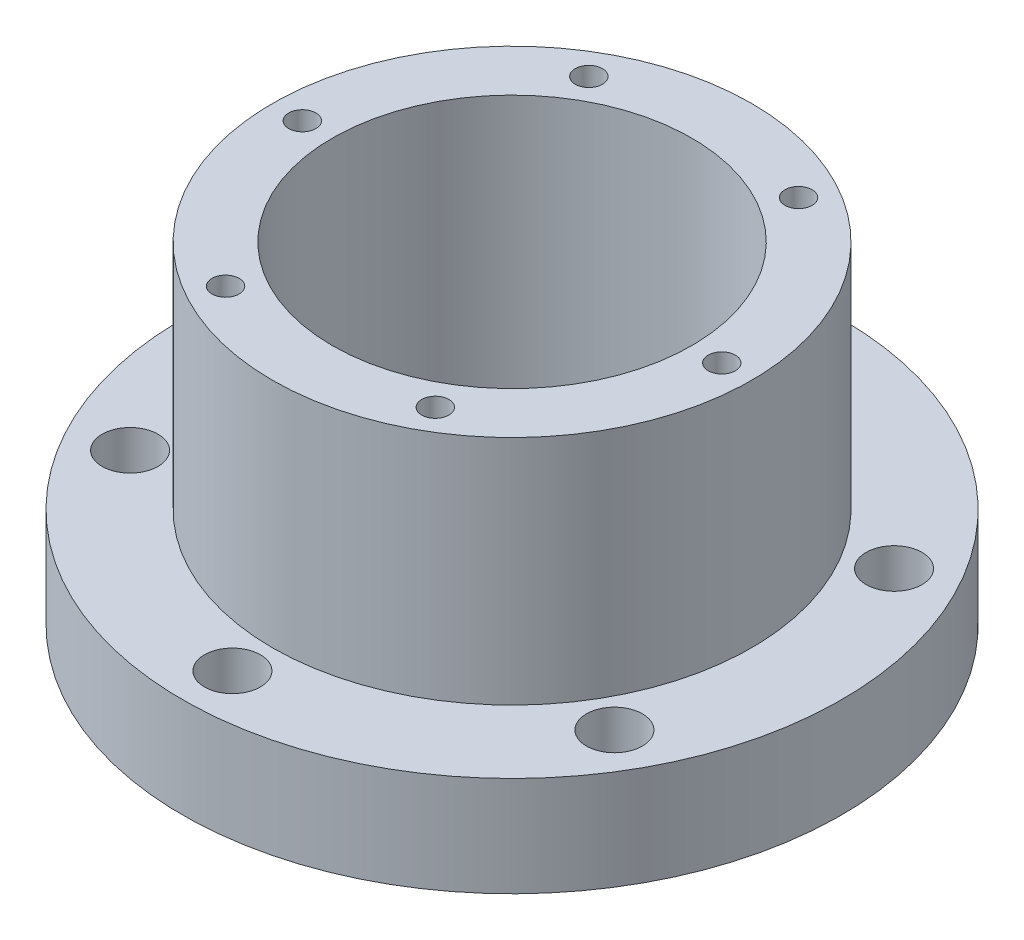
ISO-10303-21;
HEADER;
FILE_DESCRIPTION(('STEP AP214'),'2;1');
FILE_NAME('part.step','',(''),(''),'','','');
FILE_SCHEMA(('AUTOMOTIVE_DESIGN { 1 0 10303 214 1 1 1 1 }'));
ENDSEC;
DATA;
#1=APPLICATION_CONTEXT('core data for automotive mechanical design processes');
#2=APPLICATION_PROTOCOL_DEFINITION('international standard','automotive_design',2000,#1);
#3=PRODUCT_CONTEXT('',#1,'mechanical');
#4=PRODUCT('Part','Part','',(#3));
#5=PRODUCT_RELATED_PRODUCT_CATEGORY('part','',(#4));
#6=PRODUCT_DEFINITION_FORMATION('','',#4);
#7=PRODUCT_DEFINITION_CONTEXT('part definition',#1,'design');
#8=PRODUCT_DEFINITION('design','',#6,#7);
#9=PRODUCT_DEFINITION_SHAPE('','',#8);
#10=(LENGTH_UNIT() NAMED_UNIT(*) SI_UNIT(.MILLI.,.METRE.));
#11=(NAMED_UNIT(*) PLANE_ANGLE_UNIT() SI_UNIT($,.RADIAN.));
#12=(NAMED_UNIT(*) SI_UNIT($,.STERADIAN.) SOLID_ANGLE_UNIT());
#13=UNCERTAINTY_MEASURE_WITH_UNIT(LENGTH_MEASURE(1.E-05),#10,'distance_accuracy_value','');
#14=(GEOMETRIC_REPRESENTATION_CONTEXT(3) GLOBAL_UNCERTAINTY_ASSIGNED_CONTEXT((#13)) GLOBAL_UNIT_ASSIGNED_CONTEXT((#10,
#11,#12)) REPRESENTATION_CONTEXT('',''));
#15=CARTESIAN_POINT('',(0.,0.,0.));
#16=DIRECTION('',(0.,0.,1.));
#17=DIRECTION('',(1.,0.,0.));
#18=AXIS2_PLACEMENT_3D('',#15,#16,#17);
#19=CARTESIAN_POINT('',(26.2500000000006,62.9999999998177,45.4663336986827));
#20=DIRECTION('',(0.,1.,0.));
#21=DIRECTION('',(0.,0.,1.));
#22=AXIS2_PLACEMENT_3D('',#19,#20,#21);
#23=CONICAL_SURFACE('',#22,3.39999999978732,1.02974425858423);
#24=CARTESIAN_POINT('',(26.2500000000006,60.9570738951959,45.4663336987396));
#25=VERTEX_POINT('',#24);
#26=VERTEX_LOOP('',#25);
#27=FACE_BOUND('',#26,.T.);
#28=CARTESIAN_POINT('',(26.2500000000006,63.,45.4663336986827));
#29=DIRECTION('',(0.,1.,0.));
#30=DIRECTION('',(0.,0.,1.));
#31=AXIS2_PLACEMENT_3D('',#28,#29,#30);
#32=CIRCLE('',#31,3.39999999999988);
#33=CARTESIAN_POINT('',(26.2500000000006,63.,48.8663336986826));
#34=VERTEX_POINT('',#33);
#35=EDGE_CURVE('E50',#34,#34,#32,.T.);
#36=ORIENTED_EDGE('',*,*,#35,.T.);
#37=EDGE_LOOP('',(#36));
#38=FACE_BOUND('',#37,.T.);
#39=ADVANCED_FACE('F17',(#27,#38),#23,.F.);
#40=CARTESIAN_POINT('',(-26.2499999999996,62.9999999998745,45.4663336986833));
#41=DIRECTION('',(0.,1.,0.));
#42=DIRECTION('',(0.,0.,1.));
#43=AXIS2_PLACEMENT_3D('',#40,#41,#42);
#44=CONICAL_SURFACE('',#43,3.39999999990046,1.02974425868348);
#45=CARTESIAN_POINT('',(-26.2499999999996,60.9570738952527,45.4663336986264));
#46=VERTEX_POINT('',#45);
#47=VERTEX_LOOP('',#46);
#48=FACE_BOUND('',#47,.T.);
#49=CARTESIAN_POINT('',(-26.2499999999996,63.,45.4663336986833));
#50=DIRECTION('',(0.,1.,0.));
#51=DIRECTION('',(0.,0.,1.));
#52=AXIS2_PLACEMENT_3D('',#49,#50,#51);
#53=CIRCLE('',#52,3.39999999999988);
#54=CARTESIAN_POINT('',(-26.2499999999996,63.,48.8663336986832));
#55=VERTEX_POINT('',#54);
#56=EDGE_CURVE('E52',#55,#55,#53,.T.);
#57=ORIENTED_EDGE('',*,*,#56,.T.);
#58=EDGE_LOOP('',(#57));
#59=FACE_BOUND('',#58,.T.);
#60=ADVANCED_FACE('F47',(#48,#59),#44,.F.);
#61=CARTESIAN_POINT('',(-52.5,62.9999999998745,0.));
#62=DIRECTION('',(0.,1.,0.));
#63=DIRECTION('',(0.,0.,1.));
#64=AXIS2_PLACEMENT_3D('',#61,#62,#63);
#65=CONICAL_SURFACE('',#64,3.3999999998855,1.02974425856301);
#66=CARTESIAN_POINT('',(-52.5,60.9570738951391,5.6843418860808E-11));
#67=VERTEX_POINT('',#66);
#68=VERTEX_LOOP('',#67);
#69=FACE_BOUND('',#68,.T.);
#70=CARTESIAN_POINT('',(-52.5,63.,0.));
#71=DIRECTION('',(0.,1.,0.));
#72=DIRECTION('',(0.,0.,1.));
#73=AXIS2_PLACEMENT_3D('',#70,#71,#72);
#74=CIRCLE('',#73,3.39999999999988);
#75=CARTESIAN_POINT('',(-52.5,63.,3.39999999999988));
#76=VERTEX_POINT('',#75);
#77=EDGE_CURVE('E55',#76,#76,#74,.T.);
#78=ORIENTED_EDGE('',*,*,#77,.T.);
#79=EDGE_LOOP('',(#78));
#80=FACE_BOUND('',#79,.T.);
#81=ADVANCED_FACE('F183',(#69,#80),#65,.F.);
#82=CARTESIAN_POINT('',(-26.25,62.9999999998745,-45.4663336986829));
#83=DIRECTION('',(0.,1.,0.));
#84=DIRECTION('',(0.,0.,1.));
#85=AXIS2_PLACEMENT_3D('',#82,#83,#84);
#86=CONICAL_SURFACE('',#85,3.39999999975648,1.0297442585836);
#87=CARTESIAN_POINT('',(-26.25,60.9570738952527,-45.4663336986545));
#88=VERTEX_POINT('',#87);
#89=VERTEX_LOOP('',#88);
#90=FACE_BOUND('',#89,.T.);
#91=CARTESIAN_POINT('',(-26.25,63.,-45.4663336986829));
#92=DIRECTION('',(0.,1.,0.));
#93=DIRECTION('',(0.,0.,1.));
#94=AXIS2_PLACEMENT_3D('',#91,#92,#93);
#95=CIRCLE('',#94,3.39999999999988);
#96=CARTESIAN_POINT('',(-26.25,63.,-42.066333698683));
#97=VERTEX_POINT('',#96);
#98=EDGE_CURVE('E176',#97,#97,#95,.T.);
#99=ORIENTED_EDGE('',*,*,#98,.T.);
#100=EDGE_LOOP('',(#99));
#101=FACE_BOUND('',#100,.T.);
#102=ADVANCED_FACE('F330',(#90,#101),#86,.F.);
#103=CARTESIAN_POINT('',(26.25,62.9999999999313,-45.4663336986831));
#104=DIRECTION('',(0.,1.,0.));
#105=DIRECTION('',(0.,0.,1.));
#106=AXIS2_PLACEMENT_3D('',#103,#104,#105);
#107=CONICAL_SURFACE('',#106,3.39999999992719,1.02974425862793);
#108=CARTESIAN_POINT('',(26.25,60.9570738952527,-45.4663336986262));
#109=VERTEX_POINT('',#108);
#110=VERTEX_LOOP('',#109);
#111=FACE_BOUND('',#110,.T.);
#112=CARTESIAN_POINT('',(26.25,63.,-45.4663336986831));
#113=DIRECTION('',(0.,1.,0.));
#114=DIRECTION('',(0.,0.,1.));
#115=AXIS2_PLACEMENT_3D('',#112,#113,#114);
#116=CIRCLE('',#115,3.39999999999988);
#117=CARTESIAN_POINT('',(26.25,63.,-42.0663336986832));
#118=VERTEX_POINT('',#117);
#119=EDGE_CURVE('E171',#118,#118,#116,.T.);
#120=ORIENTED_EDGE('',*,*,#119,.T.);
#121=EDGE_LOOP('',(#120));
#122=FACE_BOUND('',#121,.T.);
#123=ADVANCED_FACE('F327',(#111,#122),#107,.F.);
#124=CARTESIAN_POINT('',(52.5,62.9999999998745,0.));
#125=DIRECTION('',(0.,1.,0.));
#126=DIRECTION('',(0.,0.,1.));
#127=AXIS2_PLACEMENT_3D('',#124,#125,#126);
#128=CONICAL_SURFACE('',#127,3.3999999998855,1.02974425856301);
#129=CARTESIAN_POINT('',(52.5,60.9570738951391,5.6843418860808E-11));
#130=VERTEX_POINT('',#129);
#131=VERTEX_LOOP('',#130);
#132=FACE_BOUND('',#131,.T.);
#133=CARTESIAN_POINT('',(52.5,63.,0.));
#134=DIRECTION('',(0.,1.,0.));
#135=DIRECTION('',(0.,0.,1.));
#136=AXIS2_PLACEMENT_3D('',#133,#134,#135);
#137=CIRCLE('',#136,3.39999999999988);
#138=CARTESIAN_POINT('',(52.5,63.,3.39999999999988));
#139=VERTEX_POINT('',#138);
#140=EDGE_CURVE('E167',#139,#139,#137,.T.);
#141=ORIENTED_EDGE('',*,*,#140,.T.);
#142=EDGE_LOOP('',(#141));
#143=FACE_BOUND('',#142,.T.);
#144=ADVANCED_FACE('F329',(#132,#143),#128,.F.);
#145=CARTESIAN_POINT('',(26.2500000000006,83.,45.4663336986827));
#146=DIRECTION('',(0.,1.,0.));
#147=DIRECTION('',(0.,0.,1.));
#148=AXIS2_PLACEMENT_3D('',#145,#146,#147);
#149=CYLINDRICAL_SURFACE('',#148,3.39999999999988);
#150=CARTESIAN_POINT('',(26.2500000000006,83.,45.4663336986827));
#151=DIRECTION('',(0.,1.,0.));
#152=DIRECTION('',(0.,0.,1.));
#153=AXIS2_PLACEMENT_3D('',#150,#151,#152);
#154=CIRCLE('',#153,3.39999999999988);
#155=CARTESIAN_POINT('',(26.2500000000006,83.,48.8663336986826));
#156=VERTEX_POINT('',#155);
#157=EDGE_CURVE('E20',#156,#156,#154,.F.);
#158=ORIENTED_EDGE('',*,*,#157,.F.);
#159=EDGE_LOOP('',(#158));
#160=FACE_BOUND('',#159,.T.);
#161=ORIENTED_EDGE('',*,*,#35,.F.);
#162=EDGE_LOOP('',(#161));
#163=FACE_BOUND('',#162,.T.);
#164=ADVANCED_FACE('F200',(#160,#163),#149,.F.);
#165=CARTESIAN_POINT('',(-26.2499999999996,83.,45.4663336986833));
#166=DIRECTION('',(0.,1.,0.));
#167=DIRECTION('',(0.,0.,1.));
#168=AXIS2_PLACEMENT_3D('',#165,#166,#167);
#169=CYLINDRICAL_SURFACE('',#168,3.39999999999988);
#170=CARTESIAN_POINT('',(-26.2499999999996,83.,45.4663336986833));
#171=DIRECTION('',(0.,1.,0.));
#172=DIRECTION('',(0.,0.,1.));
#173=AXIS2_PLACEMENT_3D('',#170,#171,#172);
#174=CIRCLE('',#173,3.39999999999988);
#175=CARTESIAN_POINT('',(-26.2499999999996,83.,48.8663336986832));
#176=VERTEX_POINT('',#175);
#177=EDGE_CURVE('E162',#176,#176,#174,.F.);
#178=ORIENTED_EDGE('',*,*,#177,.F.);
#179=EDGE_LOOP('',(#178));
#180=FACE_BOUND('',#179,.T.);
#181=ORIENTED_EDGE('',*,*,#56,.F.);
#182=EDGE_LOOP('',(#181));
#183=FACE_BOUND('',#182,.T.);
#184=ADVANCED_FACE('F188',(#180,#183),#169,.F.);
#185=CARTESIAN_POINT('',(-52.5,83.,0.));
#186=DIRECTION('',(0.,1.,0.));
#187=DIRECTION('',(0.,0.,1.));
#188=AXIS2_PLACEMENT_3D('',#185,#186,#187);
#189=CYLINDRICAL_SURFACE('',#188,3.39999999999988);
#190=CARTESIAN_POINT('',(-52.5,83.,0.));
#191=DIRECTION('',(0.,1.,0.));
#192=DIRECTION('',(0.,0.,1.));
#193=AXIS2_PLACEMENT_3D('',#190,#191,#192);
#194=CIRCLE('',#193,3.39999999999988);
#195=CARTESIAN_POINT('',(-52.5,83.,3.39999999999988));
#196=VERTEX_POINT('',#195);
#197=EDGE_CURVE('E160',#196,#196,#194,.F.);
#198=ORIENTED_EDGE('',*,*,#197,.F.);
#199=EDGE_LOOP('',(#198));
#200=FACE_BOUND('',#199,.T.);
#201=ORIENTED_EDGE('',*,*,#77,.F.);
#202=EDGE_LOOP('',(#201));
#203=FACE_BOUND('',#202,.T.);
#204=ADVANCED_FACE('F185',(#200,#203),#189,.F.);
#205=CARTESIAN_POINT('',(-26.25,83.,-45.4663336986829));
#206=DIRECTION('',(0.,1.,0.));
#207=DIRECTION('',(0.,0.,1.));
#208=AXIS2_PLACEMENT_3D('',#205,#206,#207);
#209=CYLINDRICAL_SURFACE('',#208,3.39999999999988);
#210=CARTESIAN_POINT('',(-26.25,83.,-45.4663336986829));
#211=DIRECTION('',(0.,1.,0.));
#212=DIRECTION('',(0.,0.,1.));
#213=AXIS2_PLACEMENT_3D('',#210,#211,#212);
#214=CIRCLE('',#213,3.39999999999988);
#215=CARTESIAN_POINT('',(-26.25,83.,-42.066333698683));
#216=VERTEX_POINT('',#215);
#217=EDGE_CURVE('E157',#216,#216,#214,.F.);
#218=ORIENTED_EDGE('',*,*,#217,.F.);
#219=EDGE_LOOP('',(#218));
#220=FACE_BOUND('',#219,.T.);
#221=ORIENTED_EDGE('',*,*,#98,.F.);
#222=EDGE_LOOP('',(#221));
#223=FACE_BOUND('',#222,.T.);
#224=ADVANCED_FACE('F187',(#220,#223),#209,.F.);
#225=CARTESIAN_POINT('',(26.25,83.,-45.4663336986831));
#226=DIRECTION('',(0.,1.,0.));
#227=DIRECTION('',(0.,0.,1.));
#228=AXIS2_PLACEMENT_3D('',#225,#226,#227);
#229=CYLINDRICAL_SURFACE('',#228,3.39999999999988);
#230=CARTESIAN_POINT('',(26.25,83.,-45.4663336986831));
#231=DIRECTION('',(0.,1.,0.));
#232=DIRECTION('',(0.,0.,1.));
#233=AXIS2_PLACEMENT_3D('',#230,#231,#232);
#234=CIRCLE('',#233,3.39999999999988);
#235=CARTESIAN_POINT('',(26.25,83.,-42.0663336986832));
#236=VERTEX_POINT('',#235);
#237=EDGE_CURVE('E154',#236,#236,#234,.F.);
#238=ORIENTED_EDGE('',*,*,#237,.F.);
#239=EDGE_LOOP('',(#238));
#240=FACE_BOUND('',#239,.T.);
#241=ORIENTED_EDGE('',*,*,#119,.F.);
#242=EDGE_LOOP('',(#241));
#243=FACE_BOUND('',#242,.T.);
#244=ADVANCED_FACE('F197',(#240,#243),#229,.F.);
#245=CARTESIAN_POINT('',(52.5,83.,0.));
#246=DIRECTION('',(0.,1.,0.));
#247=DIRECTION('',(0.,0.,1.));
#248=AXIS2_PLACEMENT_3D('',#245,#246,#247);
#249=CYLINDRICAL_SURFACE('',#248,3.39999999999988);
#250=CARTESIAN_POINT('',(52.5,83.,0.));
#251=DIRECTION('',(0.,1.,0.));
#252=DIRECTION('',(0.,0.,1.));
#253=AXIS2_PLACEMENT_3D('',#250,#251,#252);
#254=CIRCLE('',#253,3.39999999999988);
#255=CARTESIAN_POINT('',(52.5,83.,3.39999999999988));
#256=VERTEX_POINT('',#255);
#257=EDGE_CURVE('E151',#256,#256,#254,.F.);
#258=ORIENTED_EDGE('',*,*,#257,.F.);
#259=EDGE_LOOP('',(#258));
#260=FACE_BOUND('',#259,.T.);
#261=ORIENTED_EDGE('',*,*,#140,.F.);
#262=EDGE_LOOP('',(#261));
#263=FACE_BOUND('',#262,.T.);
#264=ADVANCED_FACE('F313',(#260,#263),#249,.F.);
#265=CARTESIAN_POINT('',(0.,83.,0.));
#266=DIRECTION('',(0.,1.,0.));
#267=DIRECTION('',(0.,0.,1.));
#268=AXIS2_PLACEMENT_3D('',#265,#266,#267);
#269=PLANE('',#268);
#270=CARTESIAN_POINT('',(0.,83.,0.));
#271=DIRECTION('',(0.,-1.,0.));
#272=DIRECTION('',(0.,0.,-1.));
#273=AXIS2_PLACEMENT_3D('',#270,#271,#272);
#274=CIRCLE('',#273,60.);
#275=CARTESIAN_POINT('',(0.,83.,-60.));
#276=VERTEX_POINT('',#275);
#277=EDGE_CURVE('E145',#276,#276,#274,.T.);
#278=ORIENTED_EDGE('',*,*,#277,.F.);
#279=EDGE_LOOP('',(#278));
#280=FACE_BOUND('',#279,.T.);
#281=CARTESIAN_POINT('',(0.,83.,0.));
#282=DIRECTION('',(0.,1.,0.));
#283=DIRECTION('',(0.,0.,1.));
#284=AXIS2_PLACEMENT_3D('',#281,#282,#283);
#285=CIRCLE('',#284,45.);
#286=CARTESIAN_POINT('',(0.,83.,45.));
#287=VERTEX_POINT('',#286);
#288=EDGE_CURVE('E148',#287,#287,#285,.F.);
#289=ORIENTED_EDGE('',*,*,#288,.T.);
#290=EDGE_LOOP('',(#289));
#291=FACE_BOUND('',#290,.T.);
#292=ORIENTED_EDGE('',*,*,#257,.T.);
#293=EDGE_LOOP('',(#292));
#294=FACE_BOUND('',#293,.T.);
#295=ORIENTED_EDGE('',*,*,#237,.T.);
#296=EDGE_LOOP('',(#295));
#297=FACE_BOUND('',#296,.T.);
#298=ORIENTED_EDGE('',*,*,#217,.T.);
#299=EDGE_LOOP('',(#298));
#300=FACE_BOUND('',#299,.T.);
#301=ORIENTED_EDGE('',*,*,#197,.T.);
#302=EDGE_LOOP('',(#301));
#303=FACE_BOUND('',#302,.T.);
#304=ORIENTED_EDGE('',*,*,#177,.T.);
#305=EDGE_LOOP('',(#304));
#306=FACE_BOUND('',#305,.T.);
#307=ORIENTED_EDGE('',*,*,#157,.T.);
#308=EDGE_LOOP('',(#307));
#309=FACE_BOUND('',#308,.T.);
#310=ADVANCED_FACE('F309',(#280,#291,#294,#297,#300,#303,#306,#309),#269,.T.);
#311=CARTESIAN_POINT('',(0.,11.,0.));
#312=DIRECTION('',(0.,1.,0.));
#313=DIRECTION('',(0.,0.,1.));
#314=AXIS2_PLACEMENT_3D('',#311,#312,#313);
#315=CYLINDRICAL_SURFACE('',#314,45.);
#316=ORIENTED_EDGE('',*,*,#288,.F.);
#317=EDGE_LOOP('',(#316));
#318=FACE_BOUND('',#317,.T.);
#319=CARTESIAN_POINT('',(0.,11.,0.));
#320=DIRECTION('',(0.,1.,0.));
#321=DIRECTION('',(0.,0.,1.));
#322=AXIS2_PLACEMENT_3D('',#319,#320,#321);
#323=CIRCLE('',#322,45.);
#324=CARTESIAN_POINT('',(0.,11.,45.));
#325=VERTEX_POINT('',#324);
#326=EDGE_CURVE('E142',#325,#325,#323,.T.);
#327=ORIENTED_EDGE('',*,*,#326,.F.);
#328=EDGE_LOOP('',(#327));
#329=FACE_BOUND('',#328,.T.);
#330=ADVANCED_FACE('F305',(#318,#329),#315,.F.);
#331=CARTESIAN_POINT('',(-60.6217782649103,0.,-35.0000000000007));
#332=DIRECTION('',(0.,-1.,0.));
#333=DIRECTION('',(0.,0.,-1.));
#334=AXIS2_PLACEMENT_3D('',#331,#332,#333);
#335=CYLINDRICAL_SURFACE('',#334,7.);
#336=CARTESIAN_POINT('',(-60.6217782649103,25.,-35.0000000000007));
#337=DIRECTION('',(0.,-1.,0.));
#338=DIRECTION('',(0.,0.,-1.));
#339=AXIS2_PLACEMENT_3D('',#336,#337,#338);
#340=CIRCLE('',#339,7.);
#341=CARTESIAN_POINT('',(-60.6217782649103,25.,-42.0000000000007));
#342=VERTEX_POINT('',#341);
#343=EDGE_CURVE('E121',#342,#342,#340,.T.);
#344=ORIENTED_EDGE('',*,*,#343,.F.);
#345=EDGE_LOOP('',(#344));
#346=FACE_BOUND('',#345,.T.);
#347=CARTESIAN_POINT('',(-60.6217782649103,15.,-35.0000000000007));
#348=DIRECTION('',(0.,-1.,0.));
#349=DIRECTION('',(0.,0.,-1.));
#350=AXIS2_PLACEMENT_3D('',#347,#348,#349);
#351=CIRCLE('',#350,7.);
#352=CARTESIAN_POINT('',(-60.6217782649103,15.,-42.0000000000007));
#353=VERTEX_POINT('',#352);
#354=EDGE_CURVE('E139',#353,#353,#351,.T.);
#355=ORIENTED_EDGE('',*,*,#354,.T.);
#356=EDGE_LOOP('',(#355));
#357=FACE_BOUND('',#356,.T.);
#358=ADVANCED_FACE('F301',(#346,#357),#335,.F.);
#359=CARTESIAN_POINT('',(-60.621778264911,0.,34.9999999999995));
#360=DIRECTION('',(0.,-1.,0.));
#361=DIRECTION('',(0.,0.,-1.));
#362=AXIS2_PLACEMENT_3D('',#359,#360,#361);
#363=CYLINDRICAL_SURFACE('',#362,7.);
#364=CARTESIAN_POINT('',(-60.621778264911,25.,34.9999999999995));
#365=DIRECTION('',(0.,-1.,0.));
#366=DIRECTION('',(0.,0.,-1.));
#367=AXIS2_PLACEMENT_3D('',#364,#365,#366);
#368=CIRCLE('',#367,7.);
#369=CARTESIAN_POINT('',(-60.621778264911,25.,27.9999999999995));
#370=VERTEX_POINT('',#369);
#371=EDGE_CURVE('E118',#370,#370,#368,.T.);
#372=ORIENTED_EDGE('',*,*,#371,.F.);
#373=EDGE_LOOP('',(#372));
#374=FACE_BOUND('',#373,.T.);
#375=CARTESIAN_POINT('',(-60.621778264911,15.,34.9999999999995));
#376=DIRECTION('',(0.,-1.,0.));
#377=DIRECTION('',(0.,0.,-1.));
#378=AXIS2_PLACEMENT_3D('',#375,#376,#377);
#379=CIRCLE('',#378,7.);
#380=CARTESIAN_POINT('',(-60.621778264911,15.,27.9999999999995));
#381=VERTEX_POINT('',#380);
#382=EDGE_CURVE('E136',#381,#381,#379,.T.);
#383=ORIENTED_EDGE('',*,*,#382,.T.);
#384=EDGE_LOOP('',(#383));
#385=FACE_BOUND('',#384,.T.);
#386=ADVANCED_FACE('F297',(#374,#385),#363,.F.);
#387=CARTESIAN_POINT('',(0.,0.,70.));
#388=DIRECTION('',(0.,-1.,0.));
#389=DIRECTION('',(0.,0.,-1.));
#390=AXIS2_PLACEMENT_3D('',#387,#388,#389);
#391=CYLINDRICAL_SURFACE('',#390,7.);
#392=CARTESIAN_POINT('',(0.,25.,70.));
#393=DIRECTION('',(0.,-1.,0.));
#394=DIRECTION('',(0.,0.,-1.));
#395=AXIS2_PLACEMENT_3D('',#392,#393,#394);
#396=CIRCLE('',#395,7.);
#397=CARTESIAN_POINT('',(0.,25.,63.));
#398=VERTEX_POINT('',#397);
#399=EDGE_CURVE('E115',#398,#398,#396,.T.);
#400=ORIENTED_EDGE('',*,*,#399,.F.);
#401=EDGE_LOOP('',(#400));
#402=FACE_BOUND('',#401,.T.);
#403=CARTESIAN_POINT('',(0.,15.,70.));
#404=DIRECTION('',(0.,-1.,0.));
#405=DIRECTION('',(0.,0.,-1.));
#406=AXIS2_PLACEMENT_3D('',#403,#404,#405);
#407=CIRCLE('',#406,7.);
#408=CARTESIAN_POINT('',(0.,15.,63.));
#409=VERTEX_POINT('',#408);
#410=EDGE_CURVE('E133',#409,#409,#407,.T.);
#411=ORIENTED_EDGE('',*,*,#410,.T.);
#412=EDGE_LOOP('',(#411));
#413=FACE_BOUND('',#412,.T.);
#414=ADVANCED_FACE('F293',(#402,#413),#391,.F.);
#415=CARTESIAN_POINT('',(60.6217782649106,0.,35.));
#416=DIRECTION('',(0.,-1.,0.));
#417=DIRECTION('',(0.,0.,-1.));
#418=AXIS2_PLACEMENT_3D('',#415,#416,#417);
#419=CYLINDRICAL_SURFACE('',#418,7.);
#420=CARTESIAN_POINT('',(60.6217782649106,25.,35.));
#421=DIRECTION('',(0.,-1.,0.));
#422=DIRECTION('',(0.,0.,-1.));
#423=AXIS2_PLACEMENT_3D('',#420,#421,#422);
#424=CIRCLE('',#423,7.);
#425=CARTESIAN_POINT('',(60.6217782649106,25.,28.));
#426=VERTEX_POINT('',#425);
#427=EDGE_CURVE('E112',#426,#426,#424,.T.);
#428=ORIENTED_EDGE('',*,*,#427,.F.);
#429=EDGE_LOOP('',(#428));
#430=FACE_BOUND('',#429,.T.);
#431=CARTESIAN_POINT('',(60.6217782649106,15.,35.));
#432=DIRECTION('',(0.,-1.,0.));
#433=DIRECTION('',(0.,0.,-1.));
#434=AXIS2_PLACEMENT_3D('',#431,#432,#433);
#435=CIRCLE('',#434,7.);
#436=CARTESIAN_POINT('',(60.6217782649106,15.,28.));
#437=VERTEX_POINT('',#436);
#438=EDGE_CURVE('E130',#437,#437,#435,.T.);
#439=ORIENTED_EDGE('',*,*,#438,.T.);
#440=EDGE_LOOP('',(#439));
#441=FACE_BOUND('',#440,.T.);
#442=ADVANCED_FACE('F289',(#430,#441),#419,.F.);
#443=CARTESIAN_POINT('',(60.6217782649108,0.,-35.));
#444=DIRECTION('',(0.,-1.,0.));
#445=DIRECTION('',(0.,0.,-1.));
#446=AXIS2_PLACEMENT_3D('',#443,#444,#445);
#447=CYLINDRICAL_SURFACE('',#446,7.);
#448=CARTESIAN_POINT('',(60.6217782649108,25.,-35.));
#449=DIRECTION('',(0.,-1.,0.));
#450=DIRECTION('',(0.,0.,-1.));
#451=AXIS2_PLACEMENT_3D('',#448,#449,#450);
#452=CIRCLE('',#451,7.);
#453=CARTESIAN_POINT('',(60.6217782649108,25.,-42.));
#454=VERTEX_POINT('',#453);
#455=EDGE_CURVE('E109',#454,#454,#452,.T.);
#456=ORIENTED_EDGE('',*,*,#455,.F.);
#457=EDGE_LOOP('',(#456));
#458=FACE_BOUND('',#457,.T.);
#459=CARTESIAN_POINT('',(60.6217782649108,15.,-35.));
#460=DIRECTION('',(0.,-1.,0.));
#461=DIRECTION('',(0.,0.,-1.));
#462=AXIS2_PLACEMENT_3D('',#459,#460,#461);
#463=CIRCLE('',#462,7.);
#464=CARTESIAN_POINT('',(60.6217782649108,15.,-42.));
#465=VERTEX_POINT('',#464);
#466=EDGE_CURVE('E127',#465,#465,#463,.T.);
#467=ORIENTED_EDGE('',*,*,#466,.T.);
#468=EDGE_LOOP('',(#467));
#469=FACE_BOUND('',#468,.T.);
#470=ADVANCED_FACE('F285',(#458,#469),#447,.F.);
#471=CARTESIAN_POINT('',(0.,0.,-70.));
#472=DIRECTION('',(0.,-1.,0.));
#473=DIRECTION('',(0.,0.,-1.));
#474=AXIS2_PLACEMENT_3D('',#471,#472,#473);
#475=CYLINDRICAL_SURFACE('',#474,7.);
#476=CARTESIAN_POINT('',(0.,25.,-70.));
#477=DIRECTION('',(0.,-1.,0.));
#478=DIRECTION('',(0.,0.,-1.));
#479=AXIS2_PLACEMENT_3D('',#476,#477,#478);
#480=CIRCLE('',#479,7.);
#481=CARTESIAN_POINT('',(0.,25.,-77.));
#482=VERTEX_POINT('',#481);
#483=EDGE_CURVE('E106',#482,#482,#480,.T.);
#484=ORIENTED_EDGE('',*,*,#483,.F.);
#485=EDGE_LOOP('',(#484));
#486=FACE_BOUND('',#485,.T.);
#487=CARTESIAN_POINT('',(0.,15.,-70.));
#488=DIRECTION('',(0.,-1.,0.));
#489=DIRECTION('',(0.,0.,-1.));
#490=AXIS2_PLACEMENT_3D('',#487,#488,#489);
#491=CIRCLE('',#490,7.);
#492=CARTESIAN_POINT('',(0.,15.,-77.));
#493=VERTEX_POINT('',#492);
#494=EDGE_CURVE('E124',#493,#493,#491,.T.);
#495=ORIENTED_EDGE('',*,*,#494,.T.);
#496=EDGE_LOOP('',(#495));
#497=FACE_BOUND('',#496,.T.);
#498=ADVANCED_FACE('F281',(#486,#497),#475,.F.);
#499=CARTESIAN_POINT('',(0.,83.,0.));
#500=DIRECTION('',(0.,-1.,0.));
#501=DIRECTION('',(0.,0.,-1.));
#502=AXIS2_PLACEMENT_3D('',#499,#500,#501);
#503=CYLINDRICAL_SURFACE('',#502,60.);
#504=CARTESIAN_POINT('',(0.,25.,0.));
#505=DIRECTION('',(0.,-1.,0.));
#506=DIRECTION('',(0.,0.,-1.));
#507=AXIS2_PLACEMENT_3D('',#504,#505,#506);
#508=CIRCLE('',#507,60.);
#509=CARTESIAN_POINT('',(0.,25.,-60.));
#510=VERTEX_POINT('',#509);
#511=EDGE_CURVE('E103',#510,#510,#508,.T.);
#512=ORIENTED_EDGE('',*,*,#511,.F.);
#513=EDGE_LOOP('',(#512));
#514=FACE_BOUND('',#513,.T.);
#515=ORIENTED_EDGE('',*,*,#277,.T.);
#516=EDGE_LOOP('',(#515));
#517=FACE_BOUND('',#516,.T.);
#518=ADVANCED_FACE('F277',(#514,#517),#503,.T.);
#519=CARTESIAN_POINT('',(0.,11.,0.));
#520=DIRECTION('',(0.,1.,0.));
#521=DIRECTION('',(0.,0.,1.));
#522=AXIS2_PLACEMENT_3D('',#519,#520,#521);
#523=PLANE('',#522);
#524=ORIENTED_EDGE('',*,*,#326,.T.);
#525=EDGE_LOOP('',(#524));
#526=FACE_BOUND('',#525,.T.);
#527=CARTESIAN_POINT('',(0.,11.,0.));
#528=DIRECTION('',(0.,1.,0.));
#529=DIRECTION('',(0.,0.,1.));
#530=AXIS2_PLACEMENT_3D('',#527,#528,#529);
#531=CIRCLE('',#530,37.5);
#532=CARTESIAN_POINT('',(0.,11.,37.5));
#533=VERTEX_POINT('',#532);
#534=EDGE_CURVE('E100',#533,#533,#531,.F.);
#535=ORIENTED_EDGE('',*,*,#534,.T.);
#536=EDGE_LOOP('',(#535));
#537=FACE_BOUND('',#536,.T.);
#538=ADVANCED_FACE('F273',(#526,#537),#523,.T.);
#539=CARTESIAN_POINT('',(-53.6217782649103,15.,-35.0000000000007));
#540=DIRECTION('',(0.,1.,0.));
#541=DIRECTION('',(0.,0.,1.));
#542=AXIS2_PLACEMENT_3D('',#539,#540,#541);
#543=PLANE('',#542);
#544=CARTESIAN_POINT('',(-60.6217782649103,15.,-35.0000000000007));
#545=DIRECTION('',(0.,-1.,0.));
#546=DIRECTION('',(0.,0.,-1.));
#547=AXIS2_PLACEMENT_3D('',#544,#545,#546);
#548=CIRCLE('',#547,10.);
#549=CARTESIAN_POINT('',(-60.6217782649103,15.,-45.0000000000007));
#550=VERTEX_POINT('',#549);
#551=EDGE_CURVE('E97',#550,#550,#548,.T.);
#552=ORIENTED_EDGE('',*,*,#551,.T.);
#553=EDGE_LOOP('',(#552));
#554=FACE_BOUND('',#553,.T.);
#555=ORIENTED_EDGE('',*,*,#354,.F.);
#556=EDGE_LOOP('',(#555));
#557=FACE_BOUND('',#556,.T.);
#558=ADVANCED_FACE('F269',(#554,#557),#543,.F.);
#559=CARTESIAN_POINT('',(-53.621778264911,15.,34.9999999999995));
#560=DIRECTION('',(0.,1.,0.));
#561=DIRECTION('',(0.,0.,1.));
#562=AXIS2_PLACEMENT_3D('',#559,#560,#561);
#563=PLANE('',#562);
#564=CARTESIAN_POINT('',(-60.621778264911,15.,34.9999999999995));
#565=DIRECTION('',(0.,-1.,0.));
#566=DIRECTION('',(0.,0.,-1.));
#567=AXIS2_PLACEMENT_3D('',#564,#565,#566);
#568=CIRCLE('',#567,10.);
#569=CARTESIAN_POINT('',(-60.621778264911,15.,24.9999999999995));
#570=VERTEX_POINT('',#569);
#571=EDGE_CURVE('E94',#570,#570,#568,.T.);
#572=ORIENTED_EDGE('',*,*,#571,.T.);
#573=EDGE_LOOP('',(#572));
#574=FACE_BOUND('',#573,.T.);
#575=ORIENTED_EDGE('',*,*,#382,.F.);
#576=EDGE_LOOP('',(#575));
#577=FACE_BOUND('',#576,.T.);
#578=ADVANCED_FACE('F265',(#574,#577),#563,.F.);
#579=CARTESIAN_POINT('',(7.,15.,70.));
#580=DIRECTION('',(0.,1.,0.));
#581=DIRECTION('',(0.,0.,1.));
#582=AXIS2_PLACEMENT_3D('',#579,#580,#581);
#583=PLANE('',#582);
#584=CARTESIAN_POINT('',(0.,15.,70.));
#585=DIRECTION('',(0.,-1.,0.));
#586=DIRECTION('',(0.,0.,-1.));
#587=AXIS2_PLACEMENT_3D('',#584,#585,#586);
#588=CIRCLE('',#587,10.);
#589=CARTESIAN_POINT('',(0.,15.,60.));
#590=VERTEX_POINT('',#589);
#591=EDGE_CURVE('E91',#590,#590,#588,.T.);
#592=ORIENTED_EDGE('',*,*,#591,.T.);
#593=EDGE_LOOP('',(#592));
#594=FACE_BOUND('',#593,.T.);
#595=ORIENTED_EDGE('',*,*,#410,.F.);
#596=EDGE_LOOP('',(#595));
#597=FACE_BOUND('',#596,.T.);
#598=ADVANCED_FACE('F261',(#594,#597),#583,.F.);
#599=CARTESIAN_POINT('',(67.6217782649106,15.,35.));
#600=DIRECTION('',(0.,1.,0.));
#601=DIRECTION('',(0.,0.,1.));
#602=AXIS2_PLACEMENT_3D('',#599,#600,#601);
#603=PLANE('',#602);
#604=CARTESIAN_POINT('',(60.6217782649106,15.,35.));
#605=DIRECTION('',(0.,-1.,0.));
#606=DIRECTION('',(0.,0.,-1.));
#607=AXIS2_PLACEMENT_3D('',#604,#605,#606);
#608=CIRCLE('',#607,10.);
#609=CARTESIAN_POINT('',(60.6217782649106,15.,25.));
#610=VERTEX_POINT('',#609);
#611=EDGE_CURVE('E88',#610,#610,#608,.T.);
#612=ORIENTED_EDGE('',*,*,#611,.T.);
#613=EDGE_LOOP('',(#612));
#614=FACE_BOUND('',#613,.T.);
#615=ORIENTED_EDGE('',*,*,#438,.F.);
#616=EDGE_LOOP('',(#615));
#617=FACE_BOUND('',#616,.T.);
#618=ADVANCED_FACE('F257',(#614,#617),#603,.F.);
#619=CARTESIAN_POINT('',(67.6217782649108,15.,-35.));
#620=DIRECTION('',(0.,1.,0.));
#621=DIRECTION('',(0.,0.,1.));
#622=AXIS2_PLACEMENT_3D('',#619,#620,#621);
#623=PLANE('',#622);
#624=CARTESIAN_POINT('',(60.6217782649108,15.,-35.));
#625=DIRECTION('',(0.,-1.,0.));
#626=DIRECTION('',(0.,0.,-1.));
#627=AXIS2_PLACEMENT_3D('',#624,#625,#626);
#628=CIRCLE('',#627,10.);
#629=CARTESIAN_POINT('',(60.6217782649108,15.,-45.));
#630=VERTEX_POINT('',#629);
#631=EDGE_CURVE('E85',#630,#630,#628,.T.);
#632=ORIENTED_EDGE('',*,*,#631,.T.);
#633=EDGE_LOOP('',(#632));
#634=FACE_BOUND('',#633,.T.);
#635=ORIENTED_EDGE('',*,*,#466,.F.);
#636=EDGE_LOOP('',(#635));
#637=FACE_BOUND('',#636,.T.);
#638=ADVANCED_FACE('F253',(#634,#637),#623,.F.);
#639=CARTESIAN_POINT('',(7.,15.,-70.));
#640=DIRECTION('',(0.,1.,0.));
#641=DIRECTION('',(0.,0.,1.));
#642=AXIS2_PLACEMENT_3D('',#639,#640,#641);
#643=PLANE('',#642);
#644=CARTESIAN_POINT('',(0.,15.,-70.));
#645=DIRECTION('',(0.,-1.,0.));
#646=DIRECTION('',(0.,0.,-1.));
#647=AXIS2_PLACEMENT_3D('',#644,#645,#646);
#648=CIRCLE('',#647,10.);
#649=CARTESIAN_POINT('',(0.,15.,-80.));
#650=VERTEX_POINT('',#649);
#651=EDGE_CURVE('E82',#650,#650,#648,.T.);
#652=ORIENTED_EDGE('',*,*,#651,.T.);
#653=EDGE_LOOP('',(#652));
#654=FACE_BOUND('',#653,.T.);
#655=ORIENTED_EDGE('',*,*,#494,.F.);
#656=EDGE_LOOP('',(#655));
#657=FACE_BOUND('',#656,.T.);
#658=ADVANCED_FACE('F249',(#654,#657),#643,.F.);
#659=CARTESIAN_POINT('',(0.,25.,0.));
#660=DIRECTION('',(0.,1.,0.));
#661=DIRECTION('',(0.,0.,1.));
#662=AXIS2_PLACEMENT_3D('',#659,#660,#661);
#663=PLANE('',#662);
#664=ORIENTED_EDGE('',*,*,#511,.T.);
#665=EDGE_LOOP('',(#664));
#666=FACE_BOUND('',#665,.T.);
#667=CARTESIAN_POINT('',(0.,25.,0.));
#668=DIRECTION('',(0.,-1.,0.));
#669=DIRECTION('',(0.,0.,-1.));
#670=AXIS2_PLACEMENT_3D('',#667,#668,#669);
#671=CIRCLE('',#670,82.5);
#672=CARTESIAN_POINT('',(0.,25.,-82.5));
#673=VERTEX_POINT('',#672);
#674=EDGE_CURVE('E79',#673,#673,#671,.T.);
#675=ORIENTED_EDGE('',*,*,#674,.F.);
#676=EDGE_LOOP('',(#675));
#677=FACE_BOUND('',#676,.T.);
#678=ORIENTED_EDGE('',*,*,#483,.T.);
#679=EDGE_LOOP('',(#678));
#680=FACE_BOUND('',#679,.T.);
#681=ORIENTED_EDGE('',*,*,#455,.T.);
#682=EDGE_LOOP('',(#681));
#683=FACE_BOUND('',#682,.T.);
#684=ORIENTED_EDGE('',*,*,#427,.T.);
#685=EDGE_LOOP('',(#684));
#686=FACE_BOUND('',#685,.T.);
#687=ORIENTED_EDGE('',*,*,#399,.T.);
#688=EDGE_LOOP('',(#687));
#689=FACE_BOUND('',#688,.T.);
#690=ORIENTED_EDGE('',*,*,#371,.T.);
#691=EDGE_LOOP('',(#690));
#692=FACE_BOUND('',#691,.T.);
#693=ORIENTED_EDGE('',*,*,#343,.T.);
#694=EDGE_LOOP('',(#693));
#695=FACE_BOUND('',#694,.T.);
#696=ADVANCED_FACE('F245',(#666,#677,#680,#683,#686,#689,#692,#695),#663,.T.);
#697=CARTESIAN_POINT('',(0.,0.,0.));
#698=DIRECTION('',(0.,1.,0.));
#699=DIRECTION('',(0.,0.,1.));
#700=AXIS2_PLACEMENT_3D('',#697,#698,#699);
#701=CYLINDRICAL_SURFACE('',#700,37.5);
#702=CARTESIAN_POINT('',(0.,0.,0.));
#703=DIRECTION('',(0.,1.,0.));
#704=DIRECTION('',(0.,0.,1.));
#705=AXIS2_PLACEMENT_3D('',#702,#703,#704);
#706=CIRCLE('',#705,37.5);
#707=CARTESIAN_POINT('',(0.,0.,37.5));
#708=VERTEX_POINT('',#707);
#709=EDGE_CURVE('E76',#708,#708,#706,.F.);
#710=ORIENTED_EDGE('',*,*,#709,.T.);
#711=EDGE_LOOP('',(#710));
#712=FACE_BOUND('',#711,.T.);
#713=ORIENTED_EDGE('',*,*,#534,.F.);
#714=EDGE_LOOP('',(#713));
#715=FACE_BOUND('',#714,.T.);
#716=ADVANCED_FACE('F241',(#712,#715),#701,.F.);
#717=CARTESIAN_POINT('',(-60.6217782649103,0.,-35.0000000000007));
#718=DIRECTION('',(0.,-1.,0.));
#719=DIRECTION('',(0.,0.,-1.));
#720=AXIS2_PLACEMENT_3D('',#717,#718,#719);
#721=CYLINDRICAL_SURFACE('',#720,10.);
#722=ORIENTED_EDGE('',*,*,#551,.F.);
#723=EDGE_LOOP('',(#722));
#724=FACE_BOUND('',#723,.T.);
#725=CARTESIAN_POINT('',(-60.6217782649103,0.,-35.0000000000007));
#726=DIRECTION('',(0.,-1.,0.));
#727=DIRECTION('',(0.,0.,-1.));
#728=AXIS2_PLACEMENT_3D('',#725,#726,#727);
#729=CIRCLE('',#728,10.);
#730=CARTESIAN_POINT('',(-60.6217782649103,0.,-45.0000000000007));
#731=VERTEX_POINT('',#730);
#732=EDGE_CURVE('E73',#731,#731,#729,.T.);
#733=ORIENTED_EDGE('',*,*,#732,.T.);
#734=EDGE_LOOP('',(#733));
#735=FACE_BOUND('',#734,.T.);
#736=ADVANCED_FACE('F237',(#724,#735),#721,.F.);
#737=CARTESIAN_POINT('',(-60.621778264911,0.,34.9999999999995));
#738=DIRECTION('',(0.,-1.,0.));
#739=DIRECTION('',(0.,0.,-1.));
#740=AXIS2_PLACEMENT_3D('',#737,#738,#739);
#741=CYLINDRICAL_SURFACE('',#740,10.);
#742=ORIENTED_EDGE('',*,*,#571,.F.);
#743=EDGE_LOOP('',(#742));
#744=FACE_BOUND('',#743,.T.);
#745=CARTESIAN_POINT('',(-60.621778264911,0.,34.9999999999995));
#746=DIRECTION('',(0.,-1.,0.));
#747=DIRECTION('',(0.,0.,-1.));
#748=AXIS2_PLACEMENT_3D('',#745,#746,#747);
#749=CIRCLE('',#748,10.);
#750=CARTESIAN_POINT('',(-60.621778264911,0.,24.9999999999995));
#751=VERTEX_POINT('',#750);
#752=EDGE_CURVE('E70',#751,#751,#749,.T.);
#753=ORIENTED_EDGE('',*,*,#752,.T.);
#754=EDGE_LOOP('',(#753));
#755=FACE_BOUND('',#754,.T.);
#756=ADVANCED_FACE('F233',(#744,#755),#741,.F.);
#757=CARTESIAN_POINT('',(0.,0.,70.));
#758=DIRECTION('',(0.,-1.,0.));
#759=DIRECTION('',(0.,0.,-1.));
#760=AXIS2_PLACEMENT_3D('',#757,#758,#759);
#761=CYLINDRICAL_SURFACE('',#760,10.);
#762=ORIENTED_EDGE('',*,*,#591,.F.);
#763=EDGE_LOOP('',(#762));
#764=FACE_BOUND('',#763,.T.);
#765=CARTESIAN_POINT('',(0.,0.,70.));
#766=DIRECTION('',(0.,-1.,0.));
#767=DIRECTION('',(0.,0.,-1.));
#768=AXIS2_PLACEMENT_3D('',#765,#766,#767);
#769=CIRCLE('',#768,10.);
#770=CARTESIAN_POINT('',(0.,0.,60.));
#771=VERTEX_POINT('',#770);
#772=EDGE_CURVE('E67',#771,#771,#769,.T.);
#773=ORIENTED_EDGE('',*,*,#772,.T.);
#774=EDGE_LOOP('',(#773));
#775=FACE_BOUND('',#774,.T.);
#776=ADVANCED_FACE('F229',(#764,#775),#761,.F.);
#777=CARTESIAN_POINT('',(60.6217782649106,0.,35.));
#778=DIRECTION('',(0.,-1.,0.));
#779=DIRECTION('',(0.,0.,-1.));
#780=AXIS2_PLACEMENT_3D('',#777,#778,#779);
#781=CYLINDRICAL_SURFACE('',#780,10.);
#782=ORIENTED_EDGE('',*,*,#611,.F.);
#783=EDGE_LOOP('',(#782));
#784=FACE_BOUND('',#783,.T.);
#785=CARTESIAN_POINT('',(60.6217782649106,0.,35.));
#786=DIRECTION('',(0.,-1.,0.));
#787=DIRECTION('',(0.,0.,-1.));
#788=AXIS2_PLACEMENT_3D('',#785,#786,#787);
#789=CIRCLE('',#788,10.);
#790=CARTESIAN_POINT('',(60.6217782649106,0.,25.));
#791=VERTEX_POINT('',#790);
#792=EDGE_CURVE('E64',#791,#791,#789,.T.);
#793=ORIENTED_EDGE('',*,*,#792,.T.);
#794=EDGE_LOOP('',(#793));
#795=FACE_BOUND('',#794,.T.);
#796=ADVANCED_FACE('F225',(#784,#795),#781,.F.);
#797=CARTESIAN_POINT('',(60.6217782649108,0.,-35.));
#798=DIRECTION('',(0.,-1.,0.));
#799=DIRECTION('',(0.,0.,-1.));
#800=AXIS2_PLACEMENT_3D('',#797,#798,#799);
#801=CYLINDRICAL_SURFACE('',#800,10.);
#802=ORIENTED_EDGE('',*,*,#631,.F.);
#803=EDGE_LOOP('',(#802));
#804=FACE_BOUND('',#803,.T.);
#805=CARTESIAN_POINT('',(60.6217782649108,0.,-35.));
#806=DIRECTION('',(0.,-1.,0.));
#807=DIRECTION('',(0.,0.,-1.));
#808=AXIS2_PLACEMENT_3D('',#805,#806,#807);
#809=CIRCLE('',#808,10.);
#810=CARTESIAN_POINT('',(60.6217782649108,0.,-45.));
#811=VERTEX_POINT('',#810);
#812=EDGE_CURVE('E61',#811,#811,#809,.T.);
#813=ORIENTED_EDGE('',*,*,#812,.T.);
#814=EDGE_LOOP('',(#813));
#815=FACE_BOUND('',#814,.T.);
#816=ADVANCED_FACE('F221',(#804,#815),#801,.F.);
#817=CARTESIAN_POINT('',(0.,0.,-70.));
#818=DIRECTION('',(0.,-1.,0.));
#819=DIRECTION('',(0.,0.,-1.));
#820=AXIS2_PLACEMENT_3D('',#817,#818,#819);
#821=CYLINDRICAL_SURFACE('',#820,10.);
#822=ORIENTED_EDGE('',*,*,#651,.F.);
#823=EDGE_LOOP('',(#822));
#824=FACE_BOUND('',#823,.T.);
#825=CARTESIAN_POINT('',(0.,0.,-70.));
#826=DIRECTION('',(0.,-1.,0.));
#827=DIRECTION('',(0.,0.,-1.));
#828=AXIS2_PLACEMENT_3D('',#825,#826,#827);
#829=CIRCLE('',#828,10.);
#830=CARTESIAN_POINT('',(0.,0.,-80.));
#831=VERTEX_POINT('',#830);
#832=EDGE_CURVE('E26',#831,#831,#829,.T.);
#833=ORIENTED_EDGE('',*,*,#832,.T.);
#834=EDGE_LOOP('',(#833));
#835=FACE_BOUND('',#834,.T.);
#836=ADVANCED_FACE('F213',(#824,#835),#821,.F.);
#837=CARTESIAN_POINT('',(0.,25.,0.));
#838=DIRECTION('',(0.,-1.,0.));
#839=DIRECTION('',(0.,0.,-1.));
#840=AXIS2_PLACEMENT_3D('',#837,#838,#839);
#841=CYLINDRICAL_SURFACE('',#840,82.5);
#842=ORIENTED_EDGE('',*,*,#674,.T.);
#843=EDGE_LOOP('',(#842));
#844=FACE_BOUND('',#843,.T.);
#845=CARTESIAN_POINT('',(0.,0.,0.));
#846=DIRECTION('',(0.,-1.,0.));
#847=DIRECTION('',(0.,0.,-1.));
#848=AXIS2_PLACEMENT_3D('',#845,#846,#847);
#849=CIRCLE('',#848,82.5);
#850=CARTESIAN_POINT('',(0.,0.,-82.5));
#851=VERTEX_POINT('',#850);
#852=EDGE_CURVE('E11',#851,#851,#849,.F.);
#853=ORIENTED_EDGE('',*,*,#852,.T.);
#854=EDGE_LOOP('',(#853));
#855=FACE_BOUND('',#854,.T.);
#856=ADVANCED_FACE('F206',(#844,#855),#841,.T.);
#857=CARTESIAN_POINT('',(0.,0.,0.));
#858=DIRECTION('',(0.,1.,0.));
#859=DIRECTION('',(0.,0.,1.));
#860=AXIS2_PLACEMENT_3D('',#857,#858,#859);
#861=PLANE('',#860);
#862=ORIENTED_EDGE('',*,*,#852,.F.);
#863=EDGE_LOOP('',(#862));
#864=FACE_BOUND('',#863,.T.);
#865=ORIENTED_EDGE('',*,*,#832,.F.);
#866=EDGE_LOOP('',(#865));
#867=FACE_BOUND('',#866,.T.);
#868=ORIENTED_EDGE('',*,*,#812,.F.);
#869=EDGE_LOOP('',(#868));
#870=FACE_BOUND('',#869,.T.);
#871=ORIENTED_EDGE('',*,*,#792,.F.);
#872=EDGE_LOOP('',(#871));
#873=FACE_BOUND('',#872,.T.);
#874=ORIENTED_EDGE('',*,*,#772,.F.);
#875=EDGE_LOOP('',(#874));
#876=FACE_BOUND('',#875,.T.);
#877=ORIENTED_EDGE('',*,*,#752,.F.);
#878=EDGE_LOOP('',(#877));
#879=FACE_BOUND('',#878,.T.);
#880=ORIENTED_EDGE('',*,*,#732,.F.);
#881=EDGE_LOOP('',(#880));
#882=FACE_BOUND('',#881,.T.);
#883=ORIENTED_EDGE('',*,*,#709,.F.);
#884=EDGE_LOOP('',(#883));
#885=FACE_BOUND('',#884,.T.);
#886=ADVANCED_FACE('F204',(#864,#867,#870,#873,#876,#879,#882,#885),#861,.F.);
#887=CLOSED_SHELL('',(#39,#60,#81,#102,#123,#144,#164,#184,#204,#224,#244,#264,#310,#330,#358,
#386,#414,#442,#470,#498,#518,#538,#558,#578,#598,#618,#638,#658,#696,#716,#736,#756,#776,#796,
#816,#836,#856,#886));
#888=MANIFOLD_SOLID_BREP('B1',#887);
#889=ADVANCED_BREP_SHAPE_REPRESENTATION('',(#18,#888),#14);
#890=SHAPE_DEFINITION_REPRESENTATION(#9,#889);
ENDSEC;
END-ISO-10303-21;
